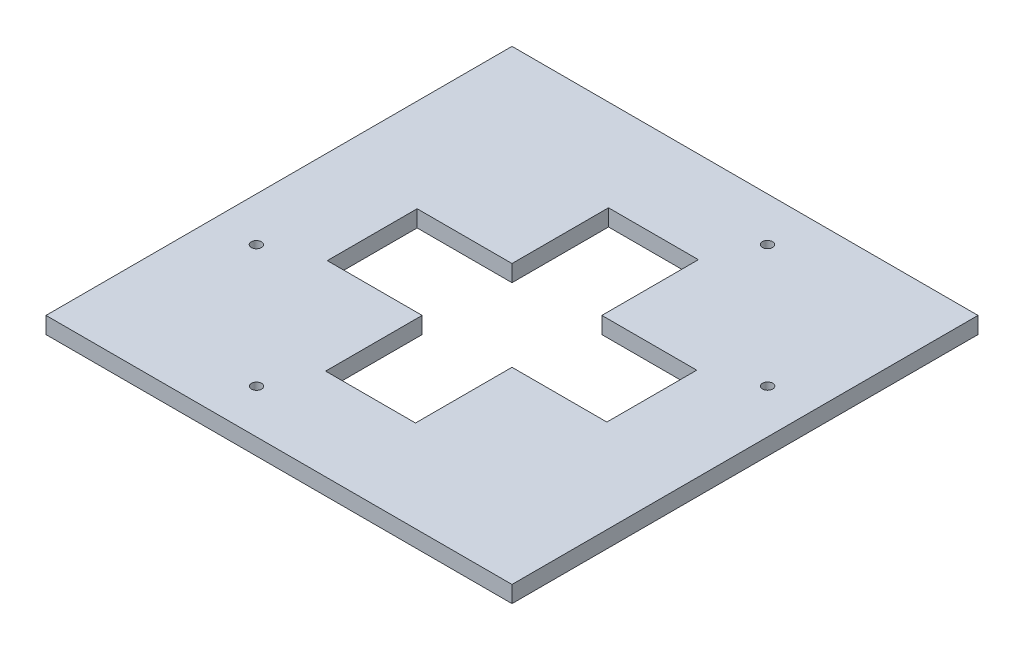
ISO-10303-21;
HEADER;
FILE_DESCRIPTION(('STEP AP214'),'2;1');
FILE_NAME('part.step','',(''),(''),'','','');
FILE_SCHEMA(('AUTOMOTIVE_DESIGN { 1 0 10303 214 1 1 1 1 }'));
ENDSEC;
DATA;
#1=APPLICATION_CONTEXT('core data for automotive mechanical design processes');
#2=APPLICATION_PROTOCOL_DEFINITION('international standard','automotive_design',2000,#1);
#3=PRODUCT_CONTEXT('',#1,'mechanical');
#4=PRODUCT('Part','Part','',(#3));
#5=PRODUCT_RELATED_PRODUCT_CATEGORY('part','',(#4));
#6=PRODUCT_DEFINITION_FORMATION('','',#4);
#7=PRODUCT_DEFINITION_CONTEXT('part definition',#1,'design');
#8=PRODUCT_DEFINITION('design','',#6,#7);
#9=PRODUCT_DEFINITION_SHAPE('','',#8);
#10=(LENGTH_UNIT() NAMED_UNIT(*) SI_UNIT(.MILLI.,.METRE.));
#11=(NAMED_UNIT(*) PLANE_ANGLE_UNIT() SI_UNIT($,.RADIAN.));
#12=(NAMED_UNIT(*) SI_UNIT($,.STERADIAN.) SOLID_ANGLE_UNIT());
#13=UNCERTAINTY_MEASURE_WITH_UNIT(LENGTH_MEASURE(1.E-05),#10,'distance_accuracy_value','');
#14=(GEOMETRIC_REPRESENTATION_CONTEXT(3) GLOBAL_UNCERTAINTY_ASSIGNED_CONTEXT((#13)) GLOBAL_UNIT_ASSIGNED_CONTEXT((#10,
#11,#12)) REPRESENTATION_CONTEXT('',''));
#15=CARTESIAN_POINT('',(0.,0.,0.));
#16=DIRECTION('',(0.,0.,1.));
#17=DIRECTION('',(1.,0.,0.));
#18=AXIS2_PLACEMENT_3D('',#15,#16,#17);
#19=CARTESIAN_POINT('',(0.,5.,0.));
#20=DIRECTION('',(0.,1.,0.));
#21=DIRECTION('',(0.,0.,1.));
#22=AXIS2_PLACEMENT_3D('',#19,#20,#21);
#23=PLANE('',#22);
#24=CARTESIAN_POINT('',(-56.8,5.,19.9963005780346));
#25=DIRECTION('',(0.,1.,0.));
#26=DIRECTION('',(0.,0.,1.));
#27=AXIS2_PLACEMENT_3D('',#24,#25,#26);
#28=CIRCLE('',#27,1.525);
#29=CARTESIAN_POINT('',(-56.8,5.,21.5213005780346));
#30=VERTEX_POINT('',#29);
#31=EDGE_CURVE('E460',#30,#30,#28,.T.);
#32=ORIENTED_EDGE('',*,*,#31,.F.);
#33=EDGE_LOOP('',(#32));
#34=FACE_BOUND('',#33,.T.);
#35=CARTESIAN_POINT('',(-19.95,5.,56.8036994219653));
#36=DIRECTION('',(0.,1.,0.));
#37=DIRECTION('',(0.,0.,1.));
#38=AXIS2_PLACEMENT_3D('',#35,#36,#37);
#39=CIRCLE('',#38,1.525);
#40=CARTESIAN_POINT('',(-19.95,5.,58.3286994219653));
#41=VERTEX_POINT('',#40);
#42=EDGE_CURVE('E464',#41,#41,#39,.T.);
#43=ORIENTED_EDGE('',*,*,#42,.F.);
#44=EDGE_LOOP('',(#43));
#45=FACE_BOUND('',#44,.T.);
#46=CARTESIAN_POINT('',(19.95,5.,-56.8036994219653));
#47=DIRECTION('',(0.,1.,0.));
#48=DIRECTION('',(0.,0.,1.));
#49=AXIS2_PLACEMENT_3D('',#46,#47,#48);
#50=CIRCLE('',#49,1.525);
#51=CARTESIAN_POINT('',(19.95,5.,-55.2786994219653));
#52=VERTEX_POINT('',#51);
#53=EDGE_CURVE('E468',#52,#52,#50,.T.);
#54=ORIENTED_EDGE('',*,*,#53,.F.);
#55=EDGE_LOOP('',(#54));
#56=FACE_BOUND('',#55,.T.);
#57=CARTESIAN_POINT('',(56.8,5.,-19.9963005780347));
#58=DIRECTION('',(0.,1.,0.));
#59=DIRECTION('',(0.,0.,1.));
#60=AXIS2_PLACEMENT_3D('',#57,#58,#59);
#61=CIRCLE('',#60,1.525);
#62=CARTESIAN_POINT('',(56.8,5.,-18.4713005780347));
#63=VERTEX_POINT('',#62);
#64=EDGE_CURVE('E471',#63,#63,#61,.T.);
#65=ORIENTED_EDGE('',*,*,#64,.F.);
#66=EDGE_LOOP('',(#65));
#67=FACE_BOUND('',#66,.T.);
#68=DIRECTION('',(1.,0.,0.));
#69=VECTOR('',#68,1.);
#70=CARTESIAN_POINT('',(0.,5.,13.5));
#71=LINE('',#70,#69);
#72=CARTESIAN_POINT('',(-42.,5.,13.5));
#73=VERTEX_POINT('',#72);
#74=CARTESIAN_POINT('',(-13.4999988271958,5.,13.5));
#75=VERTEX_POINT('',#74);
#76=EDGE_CURVE('E386',#73,#75,#71,.T.);
#77=ORIENTED_EDGE('',*,*,#76,.F.);
#78=DIRECTION('',(0.,0.,1.));
#79=VECTOR('',#78,1.);
#80=CARTESIAN_POINT('',(-42.,5.,0.));
#81=LINE('',#80,#79);
#82=CARTESIAN_POINT('',(-42.,5.,-13.5));
#83=VERTEX_POINT('',#82);
#84=EDGE_CURVE('E12',#83,#73,#81,.T.);
#85=ORIENTED_EDGE('',*,*,#84,.F.);
#86=DIRECTION('',(-1.,0.,0.));
#87=VECTOR('',#86,1.);
#88=CARTESIAN_POINT('',(0.,5.,-13.5));
#89=LINE('',#88,#87);
#90=CARTESIAN_POINT('',(-13.4999988271958,5.,-13.5));
#91=VERTEX_POINT('',#90);
#92=EDGE_CURVE('E388',#91,#83,#89,.T.);
#93=ORIENTED_EDGE('',*,*,#92,.F.);
#94=DIRECTION('',(0.,0.,-1.));
#95=VECTOR('',#94,1.);
#96=CARTESIAN_POINT('',(-13.4999988271958,5.,0.));
#97=LINE('',#96,#95);
#98=CARTESIAN_POINT('',(-13.4999988271958,5.,-42.4955381182997));
#99=VERTEX_POINT('',#98);
#100=EDGE_CURVE('E401',#91,#99,#97,.T.);
#101=ORIENTED_EDGE('',*,*,#100,.T.);
#102=DIRECTION('',(1.,0.,0.));
#103=VECTOR('',#102,1.);
#104=CARTESIAN_POINT('',(0.,5.,-42.4955381182997));
#105=LINE('',#104,#103);
#106=CARTESIAN_POINT('',(13.5,5.,-42.4955381182997));
#107=VERTEX_POINT('',#106);
#108=EDGE_CURVE('E372',#99,#107,#105,.T.);
#109=ORIENTED_EDGE('',*,*,#108,.T.);
#110=DIRECTION('',(0.,0.,-1.));
#111=VECTOR('',#110,1.);
#112=CARTESIAN_POINT('',(13.5,5.,0.));
#113=LINE('',#112,#111);
#114=CARTESIAN_POINT('',(13.5,5.,-13.5));
#115=VERTEX_POINT('',#114);
#116=EDGE_CURVE('E414',#115,#107,#113,.T.);
#117=ORIENTED_EDGE('',*,*,#116,.F.);
#118=DIRECTION('',(1.,0.,0.));
#119=VECTOR('',#118,1.);
#120=CARTESIAN_POINT('',(0.,5.,-13.5));
#121=LINE('',#120,#119);
#122=CARTESIAN_POINT('',(42.,5.,-13.5));
#123=VERTEX_POINT('',#122);
#124=EDGE_CURVE('E370',#115,#123,#121,.T.);
#125=ORIENTED_EDGE('',*,*,#124,.T.);
#126=DIRECTION('',(0.,0.,1.));
#127=VECTOR('',#126,1.);
#128=CARTESIAN_POINT('',(42.,5.,0.));
#129=LINE('',#128,#127);
#130=CARTESIAN_POINT('',(42.,5.,13.5));
#131=VERTEX_POINT('',#130);
#132=EDGE_CURVE('E349',#123,#131,#129,.T.);
#133=ORIENTED_EDGE('',*,*,#132,.T.);
#134=DIRECTION('',(-1.,0.,0.));
#135=VECTOR('',#134,1.);
#136=CARTESIAN_POINT('',(0.,5.,13.5));
#137=LINE('',#136,#135);
#138=CARTESIAN_POINT('',(13.5,5.,13.5));
#139=VERTEX_POINT('',#138);
#140=EDGE_CURVE('E359',#131,#139,#137,.T.);
#141=ORIENTED_EDGE('',*,*,#140,.T.);
#142=DIRECTION('',(0.,0.,1.));
#143=VECTOR('',#142,1.);
#144=CARTESIAN_POINT('',(13.5,5.,0.));
#145=LINE('',#144,#143);
#146=CARTESIAN_POINT('',(13.5,5.,42.4955381182996));
#147=VERTEX_POINT('',#146);
#148=EDGE_CURVE('E365',#139,#147,#145,.T.);
#149=ORIENTED_EDGE('',*,*,#148,.T.);
#150=DIRECTION('',(1.,0.,0.));
#151=VECTOR('',#150,1.);
#152=CARTESIAN_POINT('',(0.,5.,42.4955381182996));
#153=LINE('',#152,#151);
#154=CARTESIAN_POINT('',(-13.4999988271958,5.,42.4955381182996));
#155=VERTEX_POINT('',#154);
#156=EDGE_CURVE('E512',#155,#147,#153,.T.);
#157=ORIENTED_EDGE('',*,*,#156,.F.);
#158=DIRECTION('',(0.,0.,1.));
#159=VECTOR('',#158,1.);
#160=CARTESIAN_POINT('',(-13.4999988271958,5.,0.));
#161=LINE('',#160,#159);
#162=EDGE_CURVE('E434',#75,#155,#161,.T.);
#163=ORIENTED_EDGE('',*,*,#162,.F.);
#164=EDGE_LOOP('',(#77,#85,#93,#101,#109,#117,#125,#133,#141,#149,#157,#163));
#165=FACE_BOUND('',#164,.T.);
#166=DIRECTION('',(0.,0.,-1.));
#167=VECTOR('',#166,1.);
#168=CARTESIAN_POINT('',(70.,5.,-70.));
#169=LINE('',#168,#167);
#170=CARTESIAN_POINT('',(70.,5.,70.));
#171=VERTEX_POINT('',#170);
#172=CARTESIAN_POINT('',(70.,5.,-70.));
#173=VERTEX_POINT('',#172);
#174=EDGE_CURVE('E505',#171,#173,#169,.T.);
#175=ORIENTED_EDGE('',*,*,#174,.T.);
#176=DIRECTION('',(-1.,0.,0.));
#177=VECTOR('',#176,1.);
#178=CARTESIAN_POINT('',(-70.,5.,-70.));
#179=LINE('',#178,#177);
#180=CARTESIAN_POINT('',(-70.,5.,-70.));
#181=VERTEX_POINT('',#180);
#182=EDGE_CURVE('E503',#173,#181,#179,.T.);
#183=ORIENTED_EDGE('',*,*,#182,.T.);
#184=DIRECTION('',(0.,0.,1.));
#185=VECTOR('',#184,1.);
#186=CARTESIAN_POINT('',(-70.,5.,-70.));
#187=LINE('',#186,#185);
#188=CARTESIAN_POINT('',(-70.,5.,70.));
#189=VERTEX_POINT('',#188);
#190=EDGE_CURVE('E501',#181,#189,#187,.T.);
#191=ORIENTED_EDGE('',*,*,#190,.T.);
#192=DIRECTION('',(1.,0.,0.));
#193=VECTOR('',#192,1.);
#194=CARTESIAN_POINT('',(-70.,5.,70.));
#195=LINE('',#194,#193);
#196=EDGE_CURVE('E499',#189,#171,#195,.T.);
#197=ORIENTED_EDGE('',*,*,#196,.T.);
#198=EDGE_LOOP('',(#175,#183,#191,#197));
#199=FACE_BOUND('',#198,.T.);
#200=ADVANCED_FACE('F224',(#34,#45,#56,#67,#165,#199),#23,.T.);
#201=CARTESIAN_POINT('',(0.,0.,0.));
#202=DIRECTION('',(0.,1.,0.));
#203=DIRECTION('',(0.,0.,1.));
#204=AXIS2_PLACEMENT_3D('',#201,#202,#203);
#205=PLANE('',#204);
#206=CARTESIAN_POINT('',(-56.8,0.,19.9963005780346));
#207=DIRECTION('',(0.,1.,0.));
#208=DIRECTION('',(0.,0.,1.));
#209=AXIS2_PLACEMENT_3D('',#206,#207,#208);
#210=CIRCLE('',#209,1.525);
#211=CARTESIAN_POINT('',(-56.8,0.,21.5213005780346));
#212=VERTEX_POINT('',#211);
#213=EDGE_CURVE('E435',#212,#212,#210,.F.);
#214=ORIENTED_EDGE('',*,*,#213,.F.);
#215=EDGE_LOOP('',(#214));
#216=FACE_BOUND('',#215,.T.);
#217=CARTESIAN_POINT('',(-19.95,0.,56.8036994219653));
#218=DIRECTION('',(0.,1.,0.));
#219=DIRECTION('',(0.,0.,1.));
#220=AXIS2_PLACEMENT_3D('',#217,#218,#219);
#221=CIRCLE('',#220,1.525);
#222=CARTESIAN_POINT('',(-19.95,0.,58.3286994219653));
#223=VERTEX_POINT('',#222);
#224=EDGE_CURVE('E614',#223,#223,#221,.F.);
#225=ORIENTED_EDGE('',*,*,#224,.F.);
#226=EDGE_LOOP('',(#225));
#227=FACE_BOUND('',#226,.T.);
#228=CARTESIAN_POINT('',(19.95,0.,-56.8036994219653));
#229=DIRECTION('',(0.,1.,0.));
#230=DIRECTION('',(0.,0.,1.));
#231=AXIS2_PLACEMENT_3D('',#228,#229,#230);
#232=CIRCLE('',#231,1.525);
#233=CARTESIAN_POINT('',(19.95,0.,-55.2786994219653));
#234=VERTEX_POINT('',#233);
#235=EDGE_CURVE('E478',#234,#234,#232,.F.);
#236=ORIENTED_EDGE('',*,*,#235,.F.);
#237=EDGE_LOOP('',(#236));
#238=FACE_BOUND('',#237,.T.);
#239=CARTESIAN_POINT('',(56.8,0.,-19.9963005780347));
#240=DIRECTION('',(0.,1.,0.));
#241=DIRECTION('',(0.,0.,1.));
#242=AXIS2_PLACEMENT_3D('',#239,#240,#241);
#243=CIRCLE('',#242,1.525);
#244=CARTESIAN_POINT('',(56.8,0.,-18.4713005780347));
#245=VERTEX_POINT('',#244);
#246=EDGE_CURVE('E473',#245,#245,#243,.F.);
#247=ORIENTED_EDGE('',*,*,#246,.F.);
#248=EDGE_LOOP('',(#247));
#249=FACE_BOUND('',#248,.T.);
#250=DIRECTION('',(0.,0.,-1.));
#251=VECTOR('',#250,1.);
#252=CARTESIAN_POINT('',(70.,0.,-70.));
#253=LINE('',#252,#251);
#254=CARTESIAN_POINT('',(70.,0.,70.));
#255=VERTEX_POINT('',#254);
#256=CARTESIAN_POINT('',(70.,0.,-70.));
#257=VERTEX_POINT('',#256);
#258=EDGE_CURVE('E407',#255,#257,#253,.T.);
#259=ORIENTED_EDGE('',*,*,#258,.F.);
#260=DIRECTION('',(1.,0.,0.));
#261=VECTOR('',#260,1.);
#262=CARTESIAN_POINT('',(-70.,0.,70.));
#263=LINE('',#262,#261);
#264=CARTESIAN_POINT('',(-70.,0.,70.));
#265=VERTEX_POINT('',#264);
#266=EDGE_CURVE('E489',#265,#255,#263,.T.);
#267=ORIENTED_EDGE('',*,*,#266,.F.);
#268=DIRECTION('',(0.,0.,1.));
#269=VECTOR('',#268,1.);
#270=CARTESIAN_POINT('',(-70.,0.,-70.));
#271=LINE('',#270,#269);
#272=CARTESIAN_POINT('',(-70.,0.,-70.));
#273=VERTEX_POINT('',#272);
#274=EDGE_CURVE('E484',#273,#265,#271,.T.);
#275=ORIENTED_EDGE('',*,*,#274,.F.);
#276=DIRECTION('',(-1.,0.,0.));
#277=VECTOR('',#276,1.);
#278=CARTESIAN_POINT('',(-70.,0.,-70.));
#279=LINE('',#278,#277);
#280=EDGE_CURVE('E485',#257,#273,#279,.T.);
#281=ORIENTED_EDGE('',*,*,#280,.F.);
#282=EDGE_LOOP('',(#259,#267,#275,#281));
#283=FACE_BOUND('',#282,.T.);
#284=DIRECTION('',(0.,0.,-1.));
#285=VECTOR('',#284,1.);
#286=CARTESIAN_POINT('',(-42.,0.,0.));
#287=LINE('',#286,#285);
#288=CARTESIAN_POINT('',(-42.,0.,13.5));
#289=VERTEX_POINT('',#288);
#290=CARTESIAN_POINT('',(-42.,0.,-13.5));
#291=VERTEX_POINT('',#290);
#292=EDGE_CURVE('E244',#289,#291,#287,.T.);
#293=ORIENTED_EDGE('',*,*,#292,.F.);
#294=DIRECTION('',(-1.,0.,0.));
#295=VECTOR('',#294,1.);
#296=CARTESIAN_POINT('',(0.,0.,13.5));
#297=LINE('',#296,#295);
#298=CARTESIAN_POINT('',(-13.4999988271958,0.,13.5));
#299=VERTEX_POINT('',#298);
#300=EDGE_CURVE('E260',#299,#289,#297,.T.);
#301=ORIENTED_EDGE('',*,*,#300,.F.);
#302=DIRECTION('',(0.,0.,-1.));
#303=VECTOR('',#302,1.);
#304=CARTESIAN_POINT('',(-13.4999988271958,0.,0.));
#305=LINE('',#304,#303);
#306=CARTESIAN_POINT('',(-13.4999988271958,0.,42.4955381182996));
#307=VERTEX_POINT('',#306);
#308=EDGE_CURVE('E508',#307,#299,#305,.T.);
#309=ORIENTED_EDGE('',*,*,#308,.F.);
#310=DIRECTION('',(-1.,0.,0.));
#311=VECTOR('',#310,1.);
#312=CARTESIAN_POINT('',(0.,0.,42.4955381182996));
#313=LINE('',#312,#311);
#314=CARTESIAN_POINT('',(13.5,0.,42.4955381182996));
#315=VERTEX_POINT('',#314);
#316=EDGE_CURVE('E430',#315,#307,#313,.T.);
#317=ORIENTED_EDGE('',*,*,#316,.F.);
#318=DIRECTION('',(0.,0.,-1.));
#319=VECTOR('',#318,1.);
#320=CARTESIAN_POINT('',(13.5,0.,0.));
#321=LINE('',#320,#319);
#322=CARTESIAN_POINT('',(13.5,0.,13.5));
#323=VERTEX_POINT('',#322);
#324=EDGE_CURVE('E383',#315,#323,#321,.T.);
#325=ORIENTED_EDGE('',*,*,#324,.T.);
#326=DIRECTION('',(1.,0.,0.));
#327=VECTOR('',#326,1.);
#328=CARTESIAN_POINT('',(0.,0.,13.5));
#329=LINE('',#328,#327);
#330=CARTESIAN_POINT('',(42.,0.,13.5));
#331=VERTEX_POINT('',#330);
#332=EDGE_CURVE('E381',#323,#331,#329,.T.);
#333=ORIENTED_EDGE('',*,*,#332,.T.);
#334=DIRECTION('',(0.,0.,-1.));
#335=VECTOR('',#334,1.);
#336=CARTESIAN_POINT('',(42.,0.,0.));
#337=LINE('',#336,#335);
#338=CARTESIAN_POINT('',(42.,0.,-13.5));
#339=VERTEX_POINT('',#338);
#340=EDGE_CURVE('E352',#331,#339,#337,.T.);
#341=ORIENTED_EDGE('',*,*,#340,.T.);
#342=DIRECTION('',(-1.,0.,0.));
#343=VECTOR('',#342,1.);
#344=CARTESIAN_POINT('',(0.,0.,-13.5));
#345=LINE('',#344,#343);
#346=CARTESIAN_POINT('',(13.5,0.,-13.5));
#347=VERTEX_POINT('',#346);
#348=EDGE_CURVE('E376',#339,#347,#345,.T.);
#349=ORIENTED_EDGE('',*,*,#348,.T.);
#350=DIRECTION('',(0.,0.,1.));
#351=VECTOR('',#350,1.);
#352=CARTESIAN_POINT('',(13.5,0.,0.));
#353=LINE('',#352,#351);
#354=CARTESIAN_POINT('',(13.5,0.,-42.4955381182997));
#355=VERTEX_POINT('',#354);
#356=EDGE_CURVE('E423',#355,#347,#353,.T.);
#357=ORIENTED_EDGE('',*,*,#356,.F.);
#358=DIRECTION('',(-1.,0.,0.));
#359=VECTOR('',#358,1.);
#360=CARTESIAN_POINT('',(0.,0.,-42.4955381182997));
#361=LINE('',#360,#359);
#362=CARTESIAN_POINT('',(-13.4999988271958,0.,-42.4955381182997));
#363=VERTEX_POINT('',#362);
#364=EDGE_CURVE('E379',#355,#363,#361,.T.);
#365=ORIENTED_EDGE('',*,*,#364,.T.);
#366=DIRECTION('',(0.,0.,1.));
#367=VECTOR('',#366,1.);
#368=CARTESIAN_POINT('',(-13.4999988271958,0.,0.));
#369=LINE('',#368,#367);
#370=CARTESIAN_POINT('',(-13.4999988271958,0.,-13.5));
#371=VERTEX_POINT('',#370);
#372=EDGE_CURVE('E398',#363,#371,#369,.T.);
#373=ORIENTED_EDGE('',*,*,#372,.T.);
#374=DIRECTION('',(1.,0.,0.));
#375=VECTOR('',#374,1.);
#376=CARTESIAN_POINT('',(0.,0.,-13.5));
#377=LINE('',#376,#375);
#378=EDGE_CURVE('E355',#291,#371,#377,.T.);
#379=ORIENTED_EDGE('',*,*,#378,.F.);
#380=EDGE_LOOP('',(#293,#301,#309,#317,#325,#333,#341,#349,#357,#365,#373,#379));
#381=FACE_BOUND('',#380,.T.);
#382=ADVANCED_FACE('F404',(#216,#227,#238,#249,#283,#381),#205,.F.);
#383=CARTESIAN_POINT('',(70.,5.,-70.));
#384=DIRECTION('',(-1.,0.,0.));
#385=DIRECTION('',(0.,0.,1.));
#386=AXIS2_PLACEMENT_3D('',#383,#384,#385);
#387=PLANE('',#386);
#388=ORIENTED_EDGE('',*,*,#258,.T.);
#389=DIRECTION('',(0.,-1.,0.));
#390=VECTOR('',#389,1.);
#391=CARTESIAN_POINT('',(70.,5.,-70.));
#392=LINE('',#391,#390);
#393=EDGE_CURVE('E481',#173,#257,#392,.T.);
#394=ORIENTED_EDGE('',*,*,#393,.F.);
#395=ORIENTED_EDGE('',*,*,#174,.F.);
#396=DIRECTION('',(0.,-1.,0.));
#397=VECTOR('',#396,1.);
#398=CARTESIAN_POINT('',(70.,5.,70.));
#399=LINE('',#398,#397);
#400=EDGE_CURVE('E410',#171,#255,#399,.T.);
#401=ORIENTED_EDGE('',*,*,#400,.T.);
#402=EDGE_LOOP('',(#388,#394,#395,#401));
#403=FACE_BOUND('',#402,.T.);
#404=ADVANCED_FACE('F455',(#403),#387,.F.);
#405=CARTESIAN_POINT('',(-70.,5.,-70.));
#406=DIRECTION('',(0.,0.,1.));
#407=DIRECTION('',(1.,0.,0.));
#408=AXIS2_PLACEMENT_3D('',#405,#406,#407);
#409=PLANE('',#408);
#410=ORIENTED_EDGE('',*,*,#280,.T.);
#411=DIRECTION('',(0.,-1.,0.));
#412=VECTOR('',#411,1.);
#413=CARTESIAN_POINT('',(-70.,5.,-70.));
#414=LINE('',#413,#412);
#415=EDGE_CURVE('E486',#181,#273,#414,.T.);
#416=ORIENTED_EDGE('',*,*,#415,.F.);
#417=ORIENTED_EDGE('',*,*,#182,.F.);
#418=ORIENTED_EDGE('',*,*,#393,.T.);
#419=EDGE_LOOP('',(#410,#416,#417,#418));
#420=FACE_BOUND('',#419,.T.);
#421=ADVANCED_FACE('F573',(#420),#409,.F.);
#422=CARTESIAN_POINT('',(-70.,5.,-70.));
#423=DIRECTION('',(1.,0.,0.));
#424=DIRECTION('',(0.,0.,-1.));
#425=AXIS2_PLACEMENT_3D('',#422,#423,#424);
#426=PLANE('',#425);
#427=ORIENTED_EDGE('',*,*,#274,.T.);
#428=DIRECTION('',(0.,-1.,0.));
#429=VECTOR('',#428,1.);
#430=CARTESIAN_POINT('',(-70.,5.,70.));
#431=LINE('',#430,#429);
#432=EDGE_CURVE('E490',#189,#265,#431,.T.);
#433=ORIENTED_EDGE('',*,*,#432,.F.);
#434=ORIENTED_EDGE('',*,*,#190,.F.);
#435=ORIENTED_EDGE('',*,*,#415,.T.);
#436=EDGE_LOOP('',(#427,#433,#434,#435));
#437=FACE_BOUND('',#436,.T.);
#438=ADVANCED_FACE('F568',(#437),#426,.F.);
#439=CARTESIAN_POINT('',(-70.,5.,70.));
#440=DIRECTION('',(0.,0.,-1.));
#441=DIRECTION('',(-1.,0.,0.));
#442=AXIS2_PLACEMENT_3D('',#439,#440,#441);
#443=PLANE('',#442);
#444=ORIENTED_EDGE('',*,*,#266,.T.);
#445=ORIENTED_EDGE('',*,*,#400,.F.);
#446=ORIENTED_EDGE('',*,*,#196,.F.);
#447=ORIENTED_EDGE('',*,*,#432,.T.);
#448=EDGE_LOOP('',(#444,#445,#446,#447));
#449=FACE_BOUND('',#448,.T.);
#450=ADVANCED_FACE('F562',(#449),#443,.F.);
#451=CARTESIAN_POINT('',(13.5,-39.9873318134211,0.));
#452=DIRECTION('',(-1.,0.,0.));
#453=DIRECTION('',(0.,0.,1.));
#454=AXIS2_PLACEMENT_3D('',#451,#452,#453);
#455=PLANE('',#454);
#456=DIRECTION('',(0.,1.,0.));
#457=VECTOR('',#456,1.);
#458=CARTESIAN_POINT('',(13.5,-39.9873318134211,42.4955381182996));
#459=LINE('',#458,#457);
#460=EDGE_CURVE('E493',#315,#147,#459,.T.);
#461=ORIENTED_EDGE('',*,*,#460,.T.);
#462=ORIENTED_EDGE('',*,*,#148,.F.);
#463=DIRECTION('',(0.,1.,0.));
#464=VECTOR('',#463,1.);
#465=CARTESIAN_POINT('',(13.5,-39.9873318134211,13.5));
#466=LINE('',#465,#464);
#467=EDGE_CURVE('E356',#323,#139,#466,.T.);
#468=ORIENTED_EDGE('',*,*,#467,.F.);
#469=ORIENTED_EDGE('',*,*,#324,.F.);
#470=EDGE_LOOP('',(#461,#462,#468,#469));
#471=FACE_BOUND('',#470,.T.);
#472=ADVANCED_FACE('F528',(#471),#455,.T.);
#473=CARTESIAN_POINT('',(0.,-39.9873318134211,42.4955381182996));
#474=DIRECTION('',(0.,0.,1.));
#475=DIRECTION('',(1.,0.,0.));
#476=AXIS2_PLACEMENT_3D('',#473,#474,#475);
#477=PLANE('',#476);
#478=ORIENTED_EDGE('',*,*,#316,.T.);
#479=DIRECTION('',(0.,1.,0.));
#480=VECTOR('',#479,1.);
#481=CARTESIAN_POINT('',(-13.4999988271958,-39.9873318134211,42.4955381182996));
#482=LINE('',#481,#480);
#483=EDGE_CURVE('E515',#307,#155,#482,.T.);
#484=ORIENTED_EDGE('',*,*,#483,.T.);
#485=ORIENTED_EDGE('',*,*,#156,.T.);
#486=ORIENTED_EDGE('',*,*,#460,.F.);
#487=EDGE_LOOP('',(#478,#484,#485,#486));
#488=FACE_BOUND('',#487,.T.);
#489=ADVANCED_FACE('F530',(#488),#477,.F.);
#490=CARTESIAN_POINT('',(-13.4999988271958,-39.9873318134211,0.));
#491=DIRECTION('',(-1.,0.,0.));
#492=DIRECTION('',(0.,0.,1.));
#493=AXIS2_PLACEMENT_3D('',#490,#491,#492);
#494=PLANE('',#493);
#495=ORIENTED_EDGE('',*,*,#308,.T.);
#496=DIRECTION('',(0.,1.,0.));
#497=VECTOR('',#496,1.);
#498=CARTESIAN_POINT('',(-13.4999988271958,-39.9873318134211,13.5));
#499=LINE('',#498,#497);
#500=EDGE_CURVE('E511',#299,#75,#499,.T.);
#501=ORIENTED_EDGE('',*,*,#500,.T.);
#502=ORIENTED_EDGE('',*,*,#162,.T.);
#503=ORIENTED_EDGE('',*,*,#483,.F.);
#504=EDGE_LOOP('',(#495,#501,#502,#503));
#505=FACE_BOUND('',#504,.T.);
#506=ADVANCED_FACE('F535',(#505),#494,.F.);
#507=CARTESIAN_POINT('',(-13.4999988271958,-39.9873318134211,0.));
#508=DIRECTION('',(1.,0.,0.));
#509=DIRECTION('',(0.,0.,-1.));
#510=AXIS2_PLACEMENT_3D('',#507,#508,#509);
#511=PLANE('',#510);
#512=DIRECTION('',(0.,1.,0.));
#513=VECTOR('',#512,1.);
#514=CARTESIAN_POINT('',(-13.4999988271958,-39.9873318134211,-42.4955381182997));
#515=LINE('',#514,#513);
#516=EDGE_CURVE('E427',#363,#99,#515,.T.);
#517=ORIENTED_EDGE('',*,*,#516,.T.);
#518=ORIENTED_EDGE('',*,*,#100,.F.);
#519=DIRECTION('',(0.,1.,0.));
#520=VECTOR('',#519,1.);
#521=CARTESIAN_POINT('',(-13.4999988271958,-39.9873318134211,-13.5));
#522=LINE('',#521,#520);
#523=EDGE_CURVE('E267',#371,#91,#522,.T.);
#524=ORIENTED_EDGE('',*,*,#523,.F.);
#525=ORIENTED_EDGE('',*,*,#372,.F.);
#526=EDGE_LOOP('',(#517,#518,#524,#525));
#527=FACE_BOUND('',#526,.T.);
#528=ADVANCED_FACE('F397',(#527),#511,.T.);
#529=CARTESIAN_POINT('',(0.,-39.9873318134211,-42.4955381182997));
#530=DIRECTION('',(0.,0.,1.));
#531=DIRECTION('',(1.,0.,0.));
#532=AXIS2_PLACEMENT_3D('',#529,#530,#531);
#533=PLANE('',#532);
#534=DIRECTION('',(0.,1.,0.));
#535=VECTOR('',#534,1.);
#536=CARTESIAN_POINT('',(13.5,-39.9873318134211,-42.4955381182997));
#537=LINE('',#536,#535);
#538=EDGE_CURVE('E425',#355,#107,#537,.T.);
#539=ORIENTED_EDGE('',*,*,#538,.T.);
#540=ORIENTED_EDGE('',*,*,#108,.F.);
#541=ORIENTED_EDGE('',*,*,#516,.F.);
#542=ORIENTED_EDGE('',*,*,#364,.F.);
#543=EDGE_LOOP('',(#539,#540,#541,#542));
#544=FACE_BOUND('',#543,.T.);
#545=ADVANCED_FACE('F438',(#544),#533,.T.);
#546=CARTESIAN_POINT('',(13.5,-39.9873318134211,0.));
#547=DIRECTION('',(1.,0.,0.));
#548=DIRECTION('',(0.,0.,-1.));
#549=AXIS2_PLACEMENT_3D('',#546,#547,#548);
#550=PLANE('',#549);
#551=ORIENTED_EDGE('',*,*,#356,.T.);
#552=DIRECTION('',(0.,1.,0.));
#553=VECTOR('',#552,1.);
#554=CARTESIAN_POINT('',(13.5,-39.9873318134211,-13.5));
#555=LINE('',#554,#553);
#556=EDGE_CURVE('E227',#347,#115,#555,.T.);
#557=ORIENTED_EDGE('',*,*,#556,.T.);
#558=ORIENTED_EDGE('',*,*,#116,.T.);
#559=ORIENTED_EDGE('',*,*,#538,.F.);
#560=EDGE_LOOP('',(#551,#557,#558,#559));
#561=FACE_BOUND('',#560,.T.);
#562=ADVANCED_FACE('F439',(#561),#550,.F.);
#563=CARTESIAN_POINT('',(0.,-39.9873318134211,-13.5));
#564=DIRECTION('',(0.,0.,1.));
#565=DIRECTION('',(1.,0.,0.));
#566=AXIS2_PLACEMENT_3D('',#563,#564,#565);
#567=PLANE('',#566);
#568=DIRECTION('',(0.,1.,0.));
#569=VECTOR('',#568,1.);
#570=CARTESIAN_POINT('',(42.,-39.9873318134211,-13.5));
#571=LINE('',#570,#569);
#572=EDGE_CURVE('E416',#339,#123,#571,.T.);
#573=ORIENTED_EDGE('',*,*,#572,.T.);
#574=ORIENTED_EDGE('',*,*,#124,.F.);
#575=ORIENTED_EDGE('',*,*,#556,.F.);
#576=ORIENTED_EDGE('',*,*,#348,.F.);
#577=EDGE_LOOP('',(#573,#574,#575,#576));
#578=FACE_BOUND('',#577,.T.);
#579=ADVANCED_FACE('F441',(#578),#567,.T.);
#580=CARTESIAN_POINT('',(0.,-39.9873318134211,13.5));
#581=DIRECTION('',(0.,0.,-1.));
#582=DIRECTION('',(-1.,0.,0.));
#583=AXIS2_PLACEMENT_3D('',#580,#581,#582);
#584=PLANE('',#583);
#585=ORIENTED_EDGE('',*,*,#467,.T.);
#586=ORIENTED_EDGE('',*,*,#140,.F.);
#587=DIRECTION('',(0.,1.,0.));
#588=VECTOR('',#587,1.);
#589=CARTESIAN_POINT('',(42.,-39.9873318134211,13.5));
#590=LINE('',#589,#588);
#591=EDGE_CURVE('E344',#331,#131,#590,.T.);
#592=ORIENTED_EDGE('',*,*,#591,.F.);
#593=ORIENTED_EDGE('',*,*,#332,.F.);
#594=EDGE_LOOP('',(#585,#586,#592,#593));
#595=FACE_BOUND('',#594,.T.);
#596=ADVANCED_FACE('F360',(#595),#584,.T.);
#597=CARTESIAN_POINT('',(42.,-39.9873318134211,0.));
#598=DIRECTION('',(-1.,0.,0.));
#599=DIRECTION('',(0.,0.,1.));
#600=AXIS2_PLACEMENT_3D('',#597,#598,#599);
#601=PLANE('',#600);
#602=ORIENTED_EDGE('',*,*,#591,.T.);
#603=ORIENTED_EDGE('',*,*,#132,.F.);
#604=ORIENTED_EDGE('',*,*,#572,.F.);
#605=ORIENTED_EDGE('',*,*,#340,.F.);
#606=EDGE_LOOP('',(#602,#603,#604,#605));
#607=FACE_BOUND('',#606,.T.);
#608=ADVANCED_FACE('F346',(#607),#601,.T.);
#609=CARTESIAN_POINT('',(0.,-39.9873318134211,-13.5));
#610=DIRECTION('',(0.,0.,-1.));
#611=DIRECTION('',(-1.,0.,0.));
#612=AXIS2_PLACEMENT_3D('',#609,#610,#611);
#613=PLANE('',#612);
#614=ORIENTED_EDGE('',*,*,#378,.T.);
#615=ORIENTED_EDGE('',*,*,#523,.T.);
#616=ORIENTED_EDGE('',*,*,#92,.T.);
#617=DIRECTION('',(0.,1.,0.));
#618=VECTOR('',#617,1.);
#619=CARTESIAN_POINT('',(-42.,-39.9873318134211,-13.5));
#620=LINE('',#619,#618);
#621=EDGE_CURVE('E232',#291,#83,#620,.T.);
#622=ORIENTED_EDGE('',*,*,#621,.F.);
#623=EDGE_LOOP('',(#614,#615,#616,#622));
#624=FACE_BOUND('',#623,.T.);
#625=ADVANCED_FACE('F393',(#624),#613,.F.);
#626=CARTESIAN_POINT('',(0.,-39.9873318134211,13.5));
#627=DIRECTION('',(0.,0.,1.));
#628=DIRECTION('',(1.,0.,0.));
#629=AXIS2_PLACEMENT_3D('',#626,#627,#628);
#630=PLANE('',#629);
#631=ORIENTED_EDGE('',*,*,#300,.T.);
#632=DIRECTION('',(0.,1.,0.));
#633=VECTOR('',#632,1.);
#634=CARTESIAN_POINT('',(-42.,-39.9873318134211,13.5));
#635=LINE('',#634,#633);
#636=EDGE_CURVE('E257',#289,#73,#635,.T.);
#637=ORIENTED_EDGE('',*,*,#636,.T.);
#638=ORIENTED_EDGE('',*,*,#76,.T.);
#639=ORIENTED_EDGE('',*,*,#500,.F.);
#640=EDGE_LOOP('',(#631,#637,#638,#639));
#641=FACE_BOUND('',#640,.T.);
#642=ADVANCED_FACE('F536',(#641),#630,.F.);
#643=CARTESIAN_POINT('',(-42.,-39.9873318134211,0.));
#644=DIRECTION('',(-1.,0.,0.));
#645=DIRECTION('',(0.,0.,1.));
#646=AXIS2_PLACEMENT_3D('',#643,#644,#645);
#647=PLANE('',#646);
#648=ORIENTED_EDGE('',*,*,#292,.T.);
#649=ORIENTED_EDGE('',*,*,#621,.T.);
#650=ORIENTED_EDGE('',*,*,#84,.T.);
#651=ORIENTED_EDGE('',*,*,#636,.F.);
#652=EDGE_LOOP('',(#648,#649,#650,#651));
#653=FACE_BOUND('',#652,.T.);
#654=ADVANCED_FACE('F538',(#653),#647,.F.);
#655=CARTESIAN_POINT('',(56.8,-4.31335136523794,-19.9963005780347));
#656=DIRECTION('',(0.,1.,0.));
#657=DIRECTION('',(0.,0.,1.));
#658=AXIS2_PLACEMENT_3D('',#655,#656,#657);
#659=CYLINDRICAL_SURFACE('',#658,1.525);
#660=ORIENTED_EDGE('',*,*,#246,.T.);
#661=EDGE_LOOP('',(#660));
#662=FACE_BOUND('',#661,.T.);
#663=ORIENTED_EDGE('',*,*,#64,.T.);
#664=EDGE_LOOP('',(#663));
#665=FACE_BOUND('',#664,.T.);
#666=ADVANCED_FACE('F544',(#662,#665),#659,.F.);
#667=CARTESIAN_POINT('',(19.95,-4.31335136523794,-56.8036994219653));
#668=DIRECTION('',(0.,1.,0.));
#669=DIRECTION('',(0.,0.,1.));
#670=AXIS2_PLACEMENT_3D('',#667,#668,#669);
#671=CYLINDRICAL_SURFACE('',#670,1.525);
#672=ORIENTED_EDGE('',*,*,#235,.T.);
#673=EDGE_LOOP('',(#672));
#674=FACE_BOUND('',#673,.T.);
#675=ORIENTED_EDGE('',*,*,#53,.T.);
#676=EDGE_LOOP('',(#675));
#677=FACE_BOUND('',#676,.T.);
#678=ADVANCED_FACE('F597',(#674,#677),#671,.F.);
#679=CARTESIAN_POINT('',(-19.95,-4.31335136523794,56.8036994219653));
#680=DIRECTION('',(0.,1.,0.));
#681=DIRECTION('',(0.,0.,1.));
#682=AXIS2_PLACEMENT_3D('',#679,#680,#681);
#683=CYLINDRICAL_SURFACE('',#682,1.525);
#684=ORIENTED_EDGE('',*,*,#224,.T.);
#685=EDGE_LOOP('',(#684));
#686=FACE_BOUND('',#685,.T.);
#687=ORIENTED_EDGE('',*,*,#42,.T.);
#688=EDGE_LOOP('',(#687));
#689=FACE_BOUND('',#688,.T.);
#690=ADVANCED_FACE('F601',(#686,#689),#683,.F.);
#691=CARTESIAN_POINT('',(-56.8,-4.31335136523794,19.9963005780346));
#692=DIRECTION('',(0.,1.,0.));
#693=DIRECTION('',(0.,0.,1.));
#694=AXIS2_PLACEMENT_3D('',#691,#692,#693);
#695=CYLINDRICAL_SURFACE('',#694,1.525);
#696=ORIENTED_EDGE('',*,*,#213,.T.);
#697=EDGE_LOOP('',(#696));
#698=FACE_BOUND('',#697,.T.);
#699=ORIENTED_EDGE('',*,*,#31,.T.);
#700=EDGE_LOOP('',(#699));
#701=FACE_BOUND('',#700,.T.);
#702=ADVANCED_FACE('F605',(#698,#701),#695,.F.);
#703=CLOSED_SHELL('',(#200,#382,#404,#421,#438,#450,#472,#489,#506,#528,#545,#562,#579,#596,
#608,#625,#642,#654,#666,#678,#690,#702));
#704=MANIFOLD_SOLID_BREP('B2',#703);
#705=ADVANCED_BREP_SHAPE_REPRESENTATION('',(#18,#704),#14);
#706=SHAPE_DEFINITION_REPRESENTATION(#9,#705);
ENDSEC;
END-ISO-10303-21;
